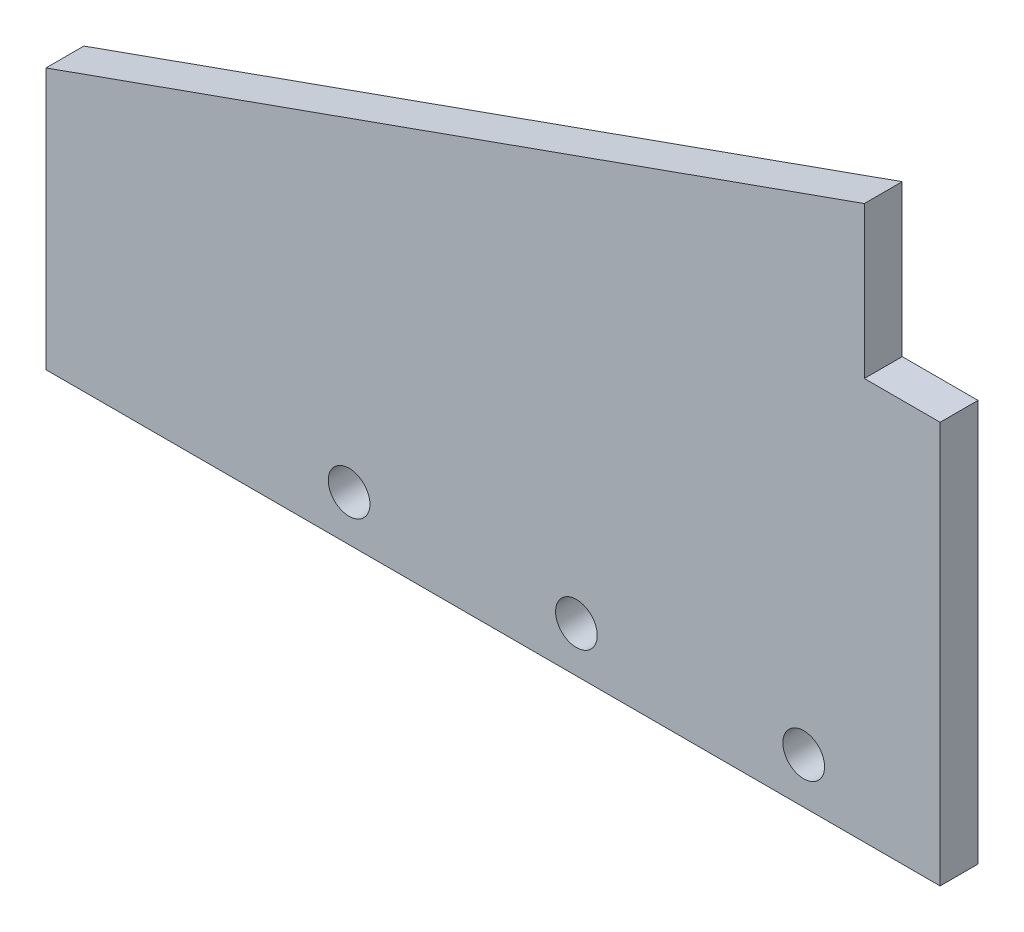
ISO-10303-21;
HEADER;
FILE_DESCRIPTION(('STEP AP214'),'2;1');
FILE_NAME('part.step','',(''),(''),'','','');
FILE_SCHEMA(('AUTOMOTIVE_DESIGN { 1 0 10303 214 1 1 1 1 }'));
ENDSEC;
DATA;
#1=APPLICATION_CONTEXT('core data for automotive mechanical design processes');
#2=APPLICATION_PROTOCOL_DEFINITION('international standard','automotive_design',2000,#1);
#3=PRODUCT_CONTEXT('',#1,'mechanical');
#4=PRODUCT('Part','Part','',(#3));
#5=PRODUCT_RELATED_PRODUCT_CATEGORY('part','',(#4));
#6=PRODUCT_DEFINITION_FORMATION('','',#4);
#7=PRODUCT_DEFINITION_CONTEXT('part definition',#1,'design');
#8=PRODUCT_DEFINITION('design','',#6,#7);
#9=PRODUCT_DEFINITION_SHAPE('','',#8);
#10=(LENGTH_UNIT() NAMED_UNIT(*) SI_UNIT(.MILLI.,.METRE.));
#11=(NAMED_UNIT(*) PLANE_ANGLE_UNIT() SI_UNIT($,.RADIAN.));
#12=(NAMED_UNIT(*) SI_UNIT($,.STERADIAN.) SOLID_ANGLE_UNIT());
#13=UNCERTAINTY_MEASURE_WITH_UNIT(LENGTH_MEASURE(1.E-05),#10,'distance_accuracy_value','');
#14=(GEOMETRIC_REPRESENTATION_CONTEXT(3) GLOBAL_UNCERTAINTY_ASSIGNED_CONTEXT((#13)) GLOBAL_UNIT_ASSIGNED_CONTEXT((#10,
#11,#12)) REPRESENTATION_CONTEXT('',''));
#15=CARTESIAN_POINT('',(0.,0.,0.));
#16=DIRECTION('',(0.,0.,1.));
#17=DIRECTION('',(1.,0.,0.));
#18=AXIS2_PLACEMENT_3D('',#15,#16,#17);
#19=CARTESIAN_POINT('',(118.,0.,5.));
#20=DIRECTION('',(0.,1.,0.));
#21=DIRECTION('',(0.,0.,1.));
#22=AXIS2_PLACEMENT_3D('',#19,#20,#21);
#23=PLANE('',#22);
#24=DIRECTION('',(1.,0.,0.));
#25=VECTOR('',#24,1.);
#26=CARTESIAN_POINT('',(118.,0.,0.));
#27=LINE('',#26,#25);
#28=CARTESIAN_POINT('',(0.,0.,0.));
#29=VERTEX_POINT('',#28);
#30=CARTESIAN_POINT('',(118.,0.,0.));
#31=VERTEX_POINT('',#30);
#32=EDGE_CURVE('E120',#29,#31,#27,.T.);
#33=ORIENTED_EDGE('',*,*,#32,.T.);
#34=DIRECTION('',(0.,0.,-1.));
#35=VECTOR('',#34,1.);
#36=CARTESIAN_POINT('',(118.,0.,5.));
#37=LINE('',#36,#35);
#38=CARTESIAN_POINT('',(118.,0.,5.));
#39=VERTEX_POINT('',#38);
#40=EDGE_CURVE('E11',#39,#31,#37,.T.);
#41=ORIENTED_EDGE('',*,*,#40,.F.);
#42=DIRECTION('',(1.,0.,0.));
#43=VECTOR('',#42,1.);
#44=CARTESIAN_POINT('',(118.,0.,5.));
#45=LINE('',#44,#43);
#46=CARTESIAN_POINT('',(0.,0.,5.));
#47=VERTEX_POINT('',#46);
#48=EDGE_CURVE('E131',#47,#39,#45,.T.);
#49=ORIENTED_EDGE('',*,*,#48,.F.);
#50=DIRECTION('',(0.,0.,-1.));
#51=VECTOR('',#50,1.);
#52=CARTESIAN_POINT('',(0.,0.,5.));
#53=LINE('',#52,#51);
#54=EDGE_CURVE('E116',#47,#29,#53,.T.);
#55=ORIENTED_EDGE('',*,*,#54,.T.);
#56=EDGE_LOOP('',(#33,#41,#49,#55));
#57=FACE_BOUND('',#56,.T.);
#58=ADVANCED_FACE('F36',(#57),#23,.F.);
#59=CARTESIAN_POINT('',(118.,53.,5.));
#60=DIRECTION('',(-1.,0.,0.));
#61=DIRECTION('',(0.,-1.,0.));
#62=AXIS2_PLACEMENT_3D('',#59,#60,#61);
#63=PLANE('',#62);
#64=DIRECTION('',(0.,1.,0.));
#65=VECTOR('',#64,1.);
#66=CARTESIAN_POINT('',(118.,53.,0.));
#67=LINE('',#66,#65);
#68=CARTESIAN_POINT('',(118.,53.,0.));
#69=VERTEX_POINT('',#68);
#70=EDGE_CURVE('E123',#31,#69,#67,.T.);
#71=ORIENTED_EDGE('',*,*,#70,.T.);
#72=DIRECTION('',(0.,0.,-1.));
#73=VECTOR('',#72,1.);
#74=CARTESIAN_POINT('',(118.,53.,5.));
#75=LINE('',#74,#73);
#76=CARTESIAN_POINT('',(118.,53.,5.));
#77=VERTEX_POINT('',#76);
#78=EDGE_CURVE('E44',#77,#69,#75,.T.);
#79=ORIENTED_EDGE('',*,*,#78,.F.);
#80=DIRECTION('',(0.,1.,0.));
#81=VECTOR('',#80,1.);
#82=CARTESIAN_POINT('',(118.,53.,5.));
#83=LINE('',#82,#81);
#84=EDGE_CURVE('E89',#39,#77,#83,.T.);
#85=ORIENTED_EDGE('',*,*,#84,.F.);
#86=ORIENTED_EDGE('',*,*,#40,.T.);
#87=EDGE_LOOP('',(#71,#79,#85,#86));
#88=FACE_BOUND('',#87,.T.);
#89=ADVANCED_FACE('F156',(#88),#63,.F.);
#90=CARTESIAN_POINT('',(118.,53.,5.));
#91=DIRECTION('',(0.,-1.,0.));
#92=DIRECTION('',(1.,0.,0.));
#93=AXIS2_PLACEMENT_3D('',#90,#91,#92);
#94=PLANE('',#93);
#95=DIRECTION('',(-1.,0.,0.));
#96=VECTOR('',#95,1.);
#97=CARTESIAN_POINT('',(118.,53.,0.));
#98=LINE('',#97,#96);
#99=CARTESIAN_POINT('',(108.,53.,0.));
#100=VERTEX_POINT('',#99);
#101=EDGE_CURVE('E126',#69,#100,#98,.T.);
#102=ORIENTED_EDGE('',*,*,#101,.T.);
#103=DIRECTION('',(0.,0.,-1.));
#104=VECTOR('',#103,1.);
#105=CARTESIAN_POINT('',(108.,53.,5.));
#106=LINE('',#105,#104);
#107=CARTESIAN_POINT('',(108.,53.,5.));
#108=VERTEX_POINT('',#107);
#109=EDGE_CURVE('E111',#108,#100,#106,.T.);
#110=ORIENTED_EDGE('',*,*,#109,.F.);
#111=DIRECTION('',(-1.,0.,0.));
#112=VECTOR('',#111,1.);
#113=CARTESIAN_POINT('',(118.,53.,5.));
#114=LINE('',#113,#112);
#115=EDGE_CURVE('E102',#77,#108,#114,.T.);
#116=ORIENTED_EDGE('',*,*,#115,.F.);
#117=ORIENTED_EDGE('',*,*,#78,.T.);
#118=EDGE_LOOP('',(#102,#110,#116,#117));
#119=FACE_BOUND('',#118,.T.);
#120=ADVANCED_FACE('F137',(#119),#94,.F.);
#121=CARTESIAN_POINT('',(108.,53.,5.));
#122=DIRECTION('',(-1.,0.,0.));
#123=DIRECTION('',(0.,0.,1.));
#124=AXIS2_PLACEMENT_3D('',#121,#122,#123);
#125=PLANE('',#124);
#126=DIRECTION('',(0.,1.,0.));
#127=VECTOR('',#126,1.);
#128=CARTESIAN_POINT('',(108.,53.,0.));
#129=LINE('',#128,#127);
#130=CARTESIAN_POINT('',(108.,73.,0.));
#131=VERTEX_POINT('',#130);
#132=EDGE_CURVE('E110',#100,#131,#129,.T.);
#133=ORIENTED_EDGE('',*,*,#132,.T.);
#134=DIRECTION('',(0.,0.,-1.));
#135=VECTOR('',#134,1.);
#136=CARTESIAN_POINT('',(108.,73.,5.));
#137=LINE('',#136,#135);
#138=CARTESIAN_POINT('',(108.,73.,5.));
#139=VERTEX_POINT('',#138);
#140=EDGE_CURVE('E107',#139,#131,#137,.T.);
#141=ORIENTED_EDGE('',*,*,#140,.F.);
#142=DIRECTION('',(0.,1.,0.));
#143=VECTOR('',#142,1.);
#144=CARTESIAN_POINT('',(108.,53.,5.));
#145=LINE('',#144,#143);
#146=EDGE_CURVE('E96',#108,#139,#145,.T.);
#147=ORIENTED_EDGE('',*,*,#146,.F.);
#148=ORIENTED_EDGE('',*,*,#109,.T.);
#149=EDGE_LOOP('',(#133,#141,#147,#148));
#150=FACE_BOUND('',#149,.T.);
#151=ADVANCED_FACE('F108',(#150),#125,.F.);
#152=CARTESIAN_POINT('',(0.,34.5,5.));
#153=DIRECTION('',(0.335783835888854,-0.9419390721038,0.));
#154=DIRECTION('',(0.9419390721038,0.335783835888854,0.));
#155=AXIS2_PLACEMENT_3D('',#152,#153,#154);
#156=PLANE('',#155);
#157=DIRECTION('',(-0.9419390721038,-0.335783835888854,0.));
#158=VECTOR('',#157,1.);
#159=CARTESIAN_POINT('',(0.,34.5,0.));
#160=LINE('',#159,#158);
#161=CARTESIAN_POINT('',(0.,34.5,0.));
#162=VERTEX_POINT('',#161);
#163=EDGE_CURVE('E75',#131,#162,#160,.T.);
#164=ORIENTED_EDGE('',*,*,#163,.T.);
#165=DIRECTION('',(0.,0.,-1.));
#166=VECTOR('',#165,1.);
#167=CARTESIAN_POINT('',(0.,34.5,5.));
#168=LINE('',#167,#166);
#169=CARTESIAN_POINT('',(0.,34.5,5.));
#170=VERTEX_POINT('',#169);
#171=EDGE_CURVE('E112',#170,#162,#168,.T.);
#172=ORIENTED_EDGE('',*,*,#171,.F.);
#173=DIRECTION('',(-0.9419390721038,-0.335783835888854,0.));
#174=VECTOR('',#173,1.);
#175=CARTESIAN_POINT('',(0.,34.5,5.));
#176=LINE('',#175,#174);
#177=EDGE_CURVE('E100',#139,#170,#176,.T.);
#178=ORIENTED_EDGE('',*,*,#177,.F.);
#179=ORIENTED_EDGE('',*,*,#140,.T.);
#180=EDGE_LOOP('',(#164,#172,#178,#179));
#181=FACE_BOUND('',#180,.T.);
#182=ADVANCED_FACE('F114',(#181),#156,.F.);
#183=CARTESIAN_POINT('',(0.,0.,5.));
#184=DIRECTION('',(1.,0.,0.));
#185=DIRECTION('',(0.,0.,-1.));
#186=AXIS2_PLACEMENT_3D('',#183,#184,#185);
#187=PLANE('',#186);
#188=DIRECTION('',(0.,-1.,0.));
#189=VECTOR('',#188,1.);
#190=CARTESIAN_POINT('',(0.,0.,0.));
#191=LINE('',#190,#189);
#192=EDGE_CURVE('E81',#162,#29,#191,.T.);
#193=ORIENTED_EDGE('',*,*,#192,.T.);
#194=ORIENTED_EDGE('',*,*,#54,.F.);
#195=DIRECTION('',(0.,-1.,0.));
#196=VECTOR('',#195,1.);
#197=CARTESIAN_POINT('',(0.,0.,5.));
#198=LINE('',#197,#196);
#199=EDGE_CURVE('E52',#170,#47,#198,.T.);
#200=ORIENTED_EDGE('',*,*,#199,.F.);
#201=ORIENTED_EDGE('',*,*,#171,.T.);
#202=EDGE_LOOP('',(#193,#194,#200,#201));
#203=FACE_BOUND('',#202,.T.);
#204=ADVANCED_FACE('F144',(#203),#187,.F.);
#205=CARTESIAN_POINT('',(0.,0.,5.));
#206=DIRECTION('',(0.,0.,-1.));
#207=DIRECTION('',(-1.,0.,0.));
#208=AXIS2_PLACEMENT_3D('',#205,#206,#207);
#209=PLANE('',#208);
#210=CARTESIAN_POINT('',(100.,6.,5.));
#211=DIRECTION('',(0.,0.,1.));
#212=DIRECTION('',(1.,0.,0.));
#213=AXIS2_PLACEMENT_3D('',#210,#211,#212);
#214=CIRCLE('',#213,2.74999999999999);
#215=CARTESIAN_POINT('',(102.75,6.,5.));
#216=VERTEX_POINT('',#215);
#217=EDGE_CURVE('E232',#216,#216,#214,.T.);
#218=ORIENTED_EDGE('',*,*,#217,.F.);
#219=EDGE_LOOP('',(#218));
#220=FACE_BOUND('',#219,.T.);
#221=CARTESIAN_POINT('',(70.,5.99999999999999,5.));
#222=DIRECTION('',(0.,0.,1.));
#223=DIRECTION('',(1.,0.,0.));
#224=AXIS2_PLACEMENT_3D('',#221,#222,#223);
#225=CIRCLE('',#224,2.74999999999999);
#226=CARTESIAN_POINT('',(72.75,5.99999999999999,5.));
#227=VERTEX_POINT('',#226);
#228=EDGE_CURVE('E234',#227,#227,#225,.T.);
#229=ORIENTED_EDGE('',*,*,#228,.F.);
#230=EDGE_LOOP('',(#229));
#231=FACE_BOUND('',#230,.T.);
#232=CARTESIAN_POINT('',(40.,5.99999999999999,5.));
#233=DIRECTION('',(0.,0.,1.));
#234=DIRECTION('',(1.,0.,0.));
#235=AXIS2_PLACEMENT_3D('',#232,#233,#234);
#236=CIRCLE('',#235,2.74999999999999);
#237=CARTESIAN_POINT('',(42.75,5.99999999999999,5.));
#238=VERTEX_POINT('',#237);
#239=EDGE_CURVE('E242',#238,#238,#236,.T.);
#240=ORIENTED_EDGE('',*,*,#239,.F.);
#241=EDGE_LOOP('',(#240));
#242=FACE_BOUND('',#241,.T.);
#243=ORIENTED_EDGE('',*,*,#48,.T.);
#244=ORIENTED_EDGE('',*,*,#84,.T.);
#245=ORIENTED_EDGE('',*,*,#115,.T.);
#246=ORIENTED_EDGE('',*,*,#146,.T.);
#247=ORIENTED_EDGE('',*,*,#177,.T.);
#248=ORIENTED_EDGE('',*,*,#199,.T.);
#249=EDGE_LOOP('',(#243,#244,#245,#246,#247,#248));
#250=FACE_BOUND('',#249,.T.);
#251=ADVANCED_FACE('F98',(#220,#231,#242,#250),#209,.F.);
#252=CARTESIAN_POINT('',(0.,0.,0.));
#253=DIRECTION('',(0.,0.,-1.));
#254=DIRECTION('',(-1.,0.,0.));
#255=AXIS2_PLACEMENT_3D('',#252,#253,#254);
#256=PLANE('',#255);
#257=CARTESIAN_POINT('',(100.,6.,0.));
#258=DIRECTION('',(0.,0.,1.));
#259=DIRECTION('',(1.,0.,0.));
#260=AXIS2_PLACEMENT_3D('',#257,#258,#259);
#261=CIRCLE('',#260,2.74999999999999);
#262=CARTESIAN_POINT('',(102.75,6.,0.));
#263=VERTEX_POINT('',#262);
#264=EDGE_CURVE('E229',#263,#263,#261,.T.);
#265=ORIENTED_EDGE('',*,*,#264,.T.);
#266=EDGE_LOOP('',(#265));
#267=FACE_BOUND('',#266,.T.);
#268=CARTESIAN_POINT('',(70.,5.99999999999999,0.));
#269=DIRECTION('',(0.,0.,1.));
#270=DIRECTION('',(1.,0.,0.));
#271=AXIS2_PLACEMENT_3D('',#268,#269,#270);
#272=CIRCLE('',#271,2.74999999999999);
#273=CARTESIAN_POINT('',(72.75,5.99999999999999,0.));
#274=VERTEX_POINT('',#273);
#275=EDGE_CURVE('E239',#274,#274,#272,.T.);
#276=ORIENTED_EDGE('',*,*,#275,.T.);
#277=EDGE_LOOP('',(#276));
#278=FACE_BOUND('',#277,.T.);
#279=CARTESIAN_POINT('',(40.,5.99999999999999,0.));
#280=DIRECTION('',(0.,0.,1.));
#281=DIRECTION('',(1.,0.,0.));
#282=AXIS2_PLACEMENT_3D('',#279,#280,#281);
#283=CIRCLE('',#282,2.74999999999999);
#284=CARTESIAN_POINT('',(42.75,5.99999999999999,0.));
#285=VERTEX_POINT('',#284);
#286=EDGE_CURVE('E124',#285,#285,#283,.T.);
#287=ORIENTED_EDGE('',*,*,#286,.T.);
#288=EDGE_LOOP('',(#287));
#289=FACE_BOUND('',#288,.T.);
#290=ORIENTED_EDGE('',*,*,#32,.F.);
#291=ORIENTED_EDGE('',*,*,#192,.F.);
#292=ORIENTED_EDGE('',*,*,#163,.F.);
#293=ORIENTED_EDGE('',*,*,#132,.F.);
#294=ORIENTED_EDGE('',*,*,#101,.F.);
#295=ORIENTED_EDGE('',*,*,#70,.F.);
#296=EDGE_LOOP('',(#290,#291,#292,#293,#294,#295));
#297=FACE_BOUND('',#296,.T.);
#298=ADVANCED_FACE('F140',(#267,#278,#289,#297),#256,.T.);
#299=CARTESIAN_POINT('',(40.,5.99999999999999,5.));
#300=DIRECTION('',(0.,0.,1.));
#301=DIRECTION('',(1.,0.,0.));
#302=AXIS2_PLACEMENT_3D('',#299,#300,#301);
#303=CYLINDRICAL_SURFACE('',#302,2.74999999999999);
#304=ORIENTED_EDGE('',*,*,#286,.F.);
#305=EDGE_LOOP('',(#304));
#306=FACE_BOUND('',#305,.T.);
#307=ORIENTED_EDGE('',*,*,#239,.T.);
#308=EDGE_LOOP('',(#307));
#309=FACE_BOUND('',#308,.T.);
#310=ADVANCED_FACE('F193',(#306,#309),#303,.F.);
#311=CARTESIAN_POINT('',(70.,5.99999999999999,5.));
#312=DIRECTION('',(0.,0.,1.));
#313=DIRECTION('',(1.,0.,0.));
#314=AXIS2_PLACEMENT_3D('',#311,#312,#313);
#315=CYLINDRICAL_SURFACE('',#314,2.74999999999999);
#316=ORIENTED_EDGE('',*,*,#275,.F.);
#317=EDGE_LOOP('',(#316));
#318=FACE_BOUND('',#317,.T.);
#319=ORIENTED_EDGE('',*,*,#228,.T.);
#320=EDGE_LOOP('',(#319));
#321=FACE_BOUND('',#320,.T.);
#322=ADVANCED_FACE('F202',(#318,#321),#315,.F.);
#323=CARTESIAN_POINT('',(100.,6.,5.));
#324=DIRECTION('',(0.,0.,1.));
#325=DIRECTION('',(1.,0.,0.));
#326=AXIS2_PLACEMENT_3D('',#323,#324,#325);
#327=CYLINDRICAL_SURFACE('',#326,2.74999999999999);
#328=ORIENTED_EDGE('',*,*,#264,.F.);
#329=EDGE_LOOP('',(#328));
#330=FACE_BOUND('',#329,.T.);
#331=ORIENTED_EDGE('',*,*,#217,.T.);
#332=EDGE_LOOP('',(#331));
#333=FACE_BOUND('',#332,.T.);
#334=ADVANCED_FACE('F212',(#330,#333),#327,.F.);
#335=CLOSED_SHELL('',(#58,#89,#120,#151,#182,#204,#251,#298,#310,#322,#334));
#336=MANIFOLD_SOLID_BREP('B2',#335);
#337=ADVANCED_BREP_SHAPE_REPRESENTATION('',(#18,#336),#14);
#338=SHAPE_DEFINITION_REPRESENTATION(#9,#337);
ENDSEC;
END-ISO-10303-21;
